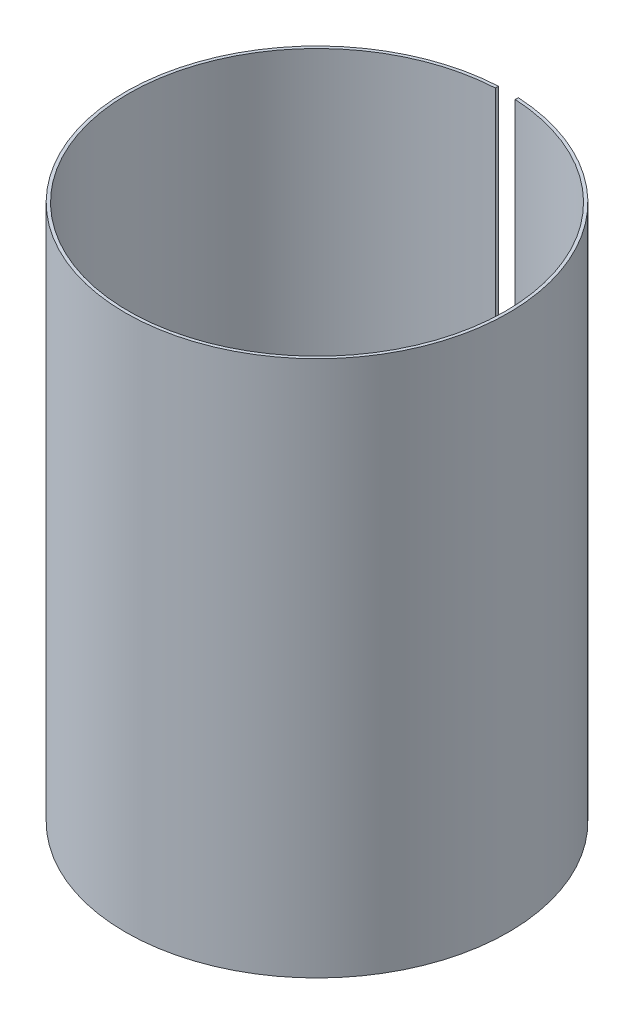
ISO-10303-21;
HEADER;
FILE_DESCRIPTION(('STEP AP214'),'2;1');
FILE_NAME('part.step','',(''),(''),'','','');
FILE_SCHEMA(('AUTOMOTIVE_DESIGN { 1 0 10303 214 1 1 1 1 }'));
ENDSEC;
DATA;
#1=APPLICATION_CONTEXT('core data for automotive mechanical design processes');
#2=APPLICATION_PROTOCOL_DEFINITION('international standard','automotive_design',2000,#1);
#3=PRODUCT_CONTEXT('',#1,'mechanical');
#4=PRODUCT('Part','Part','',(#3));
#5=PRODUCT_RELATED_PRODUCT_CATEGORY('part','',(#4));
#6=PRODUCT_DEFINITION_FORMATION('','',#4);
#7=PRODUCT_DEFINITION_CONTEXT('part definition',#1,'design');
#8=PRODUCT_DEFINITION('design','',#6,#7);
#9=PRODUCT_DEFINITION_SHAPE('','',#8);
#10=(LENGTH_UNIT() NAMED_UNIT(*) SI_UNIT(.MILLI.,.METRE.));
#11=(NAMED_UNIT(*) PLANE_ANGLE_UNIT() SI_UNIT($,.RADIAN.));
#12=(NAMED_UNIT(*) SI_UNIT($,.STERADIAN.) SOLID_ANGLE_UNIT());
#13=UNCERTAINTY_MEASURE_WITH_UNIT(LENGTH_MEASURE(1.E-05),#10,'distance_accuracy_value','');
#14=(GEOMETRIC_REPRESENTATION_CONTEXT(3) GLOBAL_UNCERTAINTY_ASSIGNED_CONTEXT((#13)) GLOBAL_UNIT_ASSIGNED_CONTEXT((#10,
#11,#12)) REPRESENTATION_CONTEXT('',''));
#15=CARTESIAN_POINT('',(0.,0.,0.));
#16=DIRECTION('',(0.,0.,1.));
#17=DIRECTION('',(1.,0.,0.));
#18=AXIS2_PLACEMENT_3D('',#15,#16,#17);
#19=CARTESIAN_POINT('',(0.,87.5,0.));
#20=DIRECTION('',(0.,1.,0.));
#21=DIRECTION('',(0.,0.,1.));
#22=AXIS2_PLACEMENT_3D('',#19,#20,#21);
#23=PLANE('',#22);
#24=DIRECTION('',(0.,0.,1.));
#25=VECTOR('',#24,1.);
#26=CARTESIAN_POINT('',(-3.25,87.5,-62.5));
#27=LINE('',#26,#25);
#28=CARTESIAN_POINT('',(-3.25,87.5,-62.4154428006403));
#29=VERTEX_POINT('',#28);
#30=CARTESIAN_POINT('',(-3.25000000000002,87.5,-61.414065978406));
#31=VERTEX_POINT('',#30);
#32=EDGE_CURVE('E61',#29,#31,#27,.T.);
#33=ORIENTED_EDGE('',*,*,#32,.F.);
#34=CARTESIAN_POINT('',(0.,87.5,0.));
#35=DIRECTION('',(0.,1.,0.));
#36=DIRECTION('',(0.,0.,1.));
#37=AXIS2_PLACEMENT_3D('',#34,#35,#36);
#38=CIRCLE('',#37,62.5);
#39=CARTESIAN_POINT('',(3.25,87.5,-62.4154428006403));
#40=VERTEX_POINT('',#39);
#41=EDGE_CURVE('E11',#29,#40,#38,.T.);
#42=ORIENTED_EDGE('',*,*,#41,.T.);
#43=DIRECTION('',(0.,0.,-1.));
#44=VECTOR('',#43,1.);
#45=CARTESIAN_POINT('',(3.25,87.5,-62.5));
#46=LINE('',#45,#44);
#47=CARTESIAN_POINT('',(3.25,87.5,-61.414065978406));
#48=VERTEX_POINT('',#47);
#49=EDGE_CURVE('E93',#48,#40,#46,.T.);
#50=ORIENTED_EDGE('',*,*,#49,.F.);
#51=CARTESIAN_POINT('',(0.,87.5,0.));
#52=DIRECTION('',(0.,1.,0.));
#53=DIRECTION('',(0.,0.,1.));
#54=AXIS2_PLACEMENT_3D('',#51,#52,#53);
#55=CIRCLE('',#54,61.5);
#56=EDGE_CURVE('E96',#31,#48,#55,.T.);
#57=ORIENTED_EDGE('',*,*,#56,.F.);
#58=EDGE_LOOP('',(#33,#42,#50,#57));
#59=FACE_BOUND('',#58,.T.);
#60=ADVANCED_FACE('F38',(#59),#23,.T.);
#61=CARTESIAN_POINT('',(0.,-87.5,0.));
#62=DIRECTION('',(0.,1.,0.));
#63=DIRECTION('',(0.,0.,1.));
#64=AXIS2_PLACEMENT_3D('',#61,#62,#63);
#65=PLANE('',#64);
#66=CARTESIAN_POINT('',(0.,-87.5,0.));
#67=DIRECTION('',(0.,1.,0.));
#68=DIRECTION('',(0.,0.,1.));
#69=AXIS2_PLACEMENT_3D('',#66,#67,#68);
#70=CIRCLE('',#69,62.5);
#71=CARTESIAN_POINT('',(-3.25,-87.5,-62.4154428006403));
#72=VERTEX_POINT('',#71);
#73=CARTESIAN_POINT('',(3.25,-87.5,-62.4154428006403));
#74=VERTEX_POINT('',#73);
#75=EDGE_CURVE('E42',#72,#74,#70,.T.);
#76=ORIENTED_EDGE('',*,*,#75,.F.);
#77=DIRECTION('',(0.,0.,1.));
#78=VECTOR('',#77,1.);
#79=CARTESIAN_POINT('',(-3.25,-87.5,-62.5));
#80=LINE('',#79,#78);
#81=CARTESIAN_POINT('',(-3.25,-87.5,-61.414065978406));
#82=VERTEX_POINT('',#81);
#83=EDGE_CURVE('E79',#72,#82,#80,.T.);
#84=ORIENTED_EDGE('',*,*,#83,.T.);
#85=CARTESIAN_POINT('',(0.,-87.5,0.));
#86=DIRECTION('',(0.,1.,0.));
#87=DIRECTION('',(0.,0.,1.));
#88=AXIS2_PLACEMENT_3D('',#85,#86,#87);
#89=CIRCLE('',#88,61.5);
#90=CARTESIAN_POINT('',(3.25,-87.5,-61.414065978406));
#91=VERTEX_POINT('',#90);
#92=EDGE_CURVE('E91',#82,#91,#89,.T.);
#93=ORIENTED_EDGE('',*,*,#92,.T.);
#94=DIRECTION('',(0.,0.,-1.));
#95=VECTOR('',#94,1.);
#96=CARTESIAN_POINT('',(3.25,-87.5,-62.5));
#97=LINE('',#96,#95);
#98=EDGE_CURVE('E53',#91,#74,#97,.T.);
#99=ORIENTED_EDGE('',*,*,#98,.T.);
#100=EDGE_LOOP('',(#76,#84,#93,#99));
#101=FACE_BOUND('',#100,.T.);
#102=ADVANCED_FACE('F90',(#101),#65,.F.);
#103=CARTESIAN_POINT('',(0.,87.5,0.));
#104=DIRECTION('',(0.,-1.,0.));
#105=DIRECTION('',(0.,0.,-1.));
#106=AXIS2_PLACEMENT_3D('',#103,#104,#105);
#107=CYLINDRICAL_SURFACE('',#106,62.5);
#108=ORIENTED_EDGE('',*,*,#41,.F.);
#109=DIRECTION('',(0.,-1.,0.));
#110=VECTOR('',#109,1.);
#111=CARTESIAN_POINT('',(-3.25,87.5,-62.4154428006403));
#112=LINE('',#111,#110);
#113=EDGE_CURVE('E97',#29,#72,#112,.T.);
#114=ORIENTED_EDGE('',*,*,#113,.T.);
#115=ORIENTED_EDGE('',*,*,#75,.T.);
#116=DIRECTION('',(0.,-1.,0.));
#117=VECTOR('',#116,1.);
#118=CARTESIAN_POINT('',(3.25,87.5,-62.4154428006403));
#119=LINE('',#118,#117);
#120=EDGE_CURVE('E100',#74,#40,#119,.F.);
#121=ORIENTED_EDGE('',*,*,#120,.T.);
#122=EDGE_LOOP('',(#108,#114,#115,#121));
#123=FACE_BOUND('',#122,.T.);
#124=ADVANCED_FACE('F40',(#123),#107,.T.);
#125=CARTESIAN_POINT('',(0.,87.5,0.));
#126=DIRECTION('',(0.,-1.,0.));
#127=DIRECTION('',(0.,0.,-1.));
#128=AXIS2_PLACEMENT_3D('',#125,#126,#127);
#129=CYLINDRICAL_SURFACE('',#128,61.5);
#130=DIRECTION('',(0.,1.,0.));
#131=VECTOR('',#130,1.);
#132=CARTESIAN_POINT('',(-3.25,-87.5,-61.414065978406));
#133=LINE('',#132,#131);
#134=EDGE_CURVE('E76',#82,#31,#133,.T.);
#135=ORIENTED_EDGE('',*,*,#134,.T.);
#136=ORIENTED_EDGE('',*,*,#56,.T.);
#137=DIRECTION('',(0.,1.,0.));
#138=VECTOR('',#137,1.);
#139=CARTESIAN_POINT('',(3.25,-87.5,-61.414065978406));
#140=LINE('',#139,#138);
#141=EDGE_CURVE('E85',#91,#48,#140,.T.);
#142=ORIENTED_EDGE('',*,*,#141,.F.);
#143=ORIENTED_EDGE('',*,*,#92,.F.);
#144=EDGE_LOOP('',(#135,#136,#142,#143));
#145=FACE_BOUND('',#144,.T.);
#146=ADVANCED_FACE('F95',(#145),#129,.F.);
#147=CARTESIAN_POINT('',(3.25,-87.5,-62.5));
#148=DIRECTION('',(1.,0.,0.));
#149=DIRECTION('',(0.,0.,-1.));
#150=AXIS2_PLACEMENT_3D('',#147,#148,#149);
#151=PLANE('',#150);
#152=ORIENTED_EDGE('',*,*,#98,.F.);
#153=ORIENTED_EDGE('',*,*,#141,.T.);
#154=ORIENTED_EDGE('',*,*,#49,.T.);
#155=ORIENTED_EDGE('',*,*,#120,.F.);
#156=EDGE_LOOP('',(#152,#153,#154,#155));
#157=FACE_BOUND('',#156,.T.);
#158=ADVANCED_FACE('F112',(#157),#151,.F.);
#159=CARTESIAN_POINT('',(-3.25,-87.5,-62.5));
#160=DIRECTION('',(-1.,0.,0.));
#161=DIRECTION('',(0.,0.,1.));
#162=AXIS2_PLACEMENT_3D('',#159,#160,#161);
#163=PLANE('',#162);
#164=ORIENTED_EDGE('',*,*,#32,.T.);
#165=ORIENTED_EDGE('',*,*,#134,.F.);
#166=ORIENTED_EDGE('',*,*,#83,.F.);
#167=ORIENTED_EDGE('',*,*,#113,.F.);
#168=EDGE_LOOP('',(#164,#165,#166,#167));
#169=FACE_BOUND('',#168,.T.);
#170=ADVANCED_FACE('F78',(#169),#163,.F.);
#171=CLOSED_SHELL('',(#60,#102,#124,#146,#158,#170));
#172=MANIFOLD_SOLID_BREP('B2',#171);
#173=ADVANCED_BREP_SHAPE_REPRESENTATION('',(#18,#172),#14);
#174=SHAPE_DEFINITION_REPRESENTATION(#9,#173);
ENDSEC;
END-ISO-10303-21;
